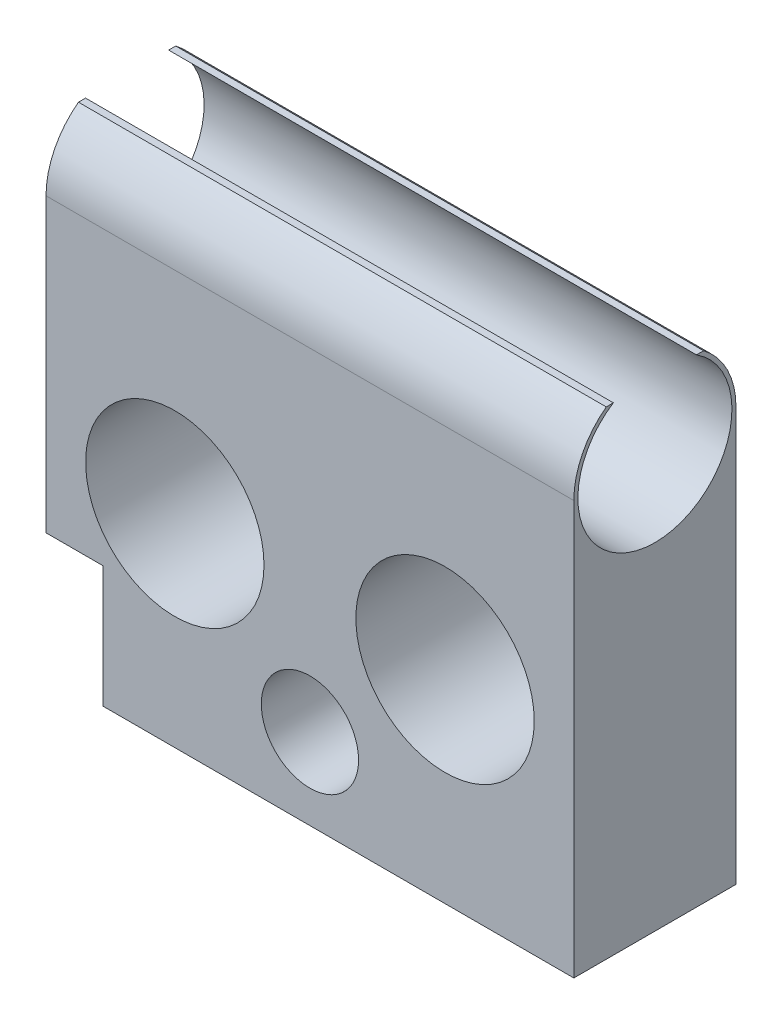
ISO-10303-21;
HEADER;
FILE_DESCRIPTION(('STEP AP214'),'2;1');
FILE_NAME('part.step','',(''),(''),'','','');
FILE_SCHEMA(('AUTOMOTIVE_DESIGN { 1 0 10303 214 1 1 1 1 }'));
ENDSEC;
DATA;
#1=APPLICATION_CONTEXT('core data for automotive mechanical design processes');
#2=APPLICATION_PROTOCOL_DEFINITION('international standard','automotive_design',2000,#1);
#3=PRODUCT_CONTEXT('',#1,'mechanical');
#4=PRODUCT('Part','Part','',(#3));
#5=PRODUCT_RELATED_PRODUCT_CATEGORY('part','',(#4));
#6=PRODUCT_DEFINITION_FORMATION('','',#4);
#7=PRODUCT_DEFINITION_CONTEXT('part definition',#1,'design');
#8=PRODUCT_DEFINITION('design','',#6,#7);
#9=PRODUCT_DEFINITION_SHAPE('','',#8);
#10=(LENGTH_UNIT() NAMED_UNIT(*) SI_UNIT(.MILLI.,.METRE.));
#11=(NAMED_UNIT(*) PLANE_ANGLE_UNIT() SI_UNIT($,.RADIAN.));
#12=(NAMED_UNIT(*) SI_UNIT($,.STERADIAN.) SOLID_ANGLE_UNIT());
#13=UNCERTAINTY_MEASURE_WITH_UNIT(LENGTH_MEASURE(1.E-05),#10,'distance_accuracy_value','');
#14=(GEOMETRIC_REPRESENTATION_CONTEXT(3) GLOBAL_UNCERTAINTY_ASSIGNED_CONTEXT((#13)) GLOBAL_UNIT_ASSIGNED_CONTEXT((#10,
#11,#12)) REPRESENTATION_CONTEXT('',''));
#15=CARTESIAN_POINT('',(0.,0.,0.));
#16=DIRECTION('',(0.,0.,1.));
#17=DIRECTION('',(1.,0.,0.));
#18=AXIS2_PLACEMENT_3D('',#15,#16,#17);
#19=CARTESIAN_POINT('',(32.55,26.,10.));
#20=DIRECTION('',(-1.,0.,0.));
#21=DIRECTION('',(0.,0.,1.));
#22=AXIS2_PLACEMENT_3D('',#19,#20,#21);
#23=CYLINDRICAL_SURFACE('',#22,10.);
#24=CARTESIAN_POINT('',(-32.55,26.,10.));
#25=DIRECTION('',(1.,0.,0.));
#26=DIRECTION('',(0.,0.,1.));
#27=AXIS2_PLACEMENT_3D('',#24,#25,#26);
#28=CIRCLE('',#27,10.);
#29=CARTESIAN_POINT('',(-32.55,26.,0.));
#30=VERTEX_POINT('',#29);
#31=CARTESIAN_POINT('',(-32.55,34.,4.));
#32=VERTEX_POINT('',#31);
#33=EDGE_CURVE('E129',#30,#32,#28,.T.);
#34=ORIENTED_EDGE('',*,*,#33,.T.);
#35=DIRECTION('',(-1.,0.,0.));
#36=VECTOR('',#35,1.);
#37=CARTESIAN_POINT('',(32.55,34.,3.99999999999999));
#38=LINE('',#37,#36);
#39=CARTESIAN_POINT('',(32.55,34.,3.99999999999998));
#40=VERTEX_POINT('',#39);
#41=EDGE_CURVE('E42',#32,#40,#38,.F.);
#42=ORIENTED_EDGE('',*,*,#41,.T.);
#43=CARTESIAN_POINT('',(32.55,26.,10.));
#44=DIRECTION('',(1.,0.,0.));
#45=DIRECTION('',(0.,0.,1.));
#46=AXIS2_PLACEMENT_3D('',#43,#44,#45);
#47=CIRCLE('',#46,10.);
#48=CARTESIAN_POINT('',(32.55,26.,0.));
#49=VERTEX_POINT('',#48);
#50=EDGE_CURVE('E128',#49,#40,#47,.T.);
#51=ORIENTED_EDGE('',*,*,#50,.F.);
#52=DIRECTION('',(-1.,0.,0.));
#53=VECTOR('',#52,1.);
#54=CARTESIAN_POINT('',(32.55,26.,0.));
#55=LINE('',#54,#53);
#56=EDGE_CURVE('E138',#49,#30,#55,.T.);
#57=ORIENTED_EDGE('',*,*,#56,.T.);
#58=EDGE_LOOP('',(#34,#42,#51,#57));
#59=FACE_BOUND('',#58,.T.);
#60=ADVANCED_FACE('F34',(#59),#23,.T.);
#61=CARTESIAN_POINT('',(0.,0.,20.));
#62=DIRECTION('',(0.,0.,-1.));
#63=DIRECTION('',(-1.,0.,0.));
#64=AXIS2_PLACEMENT_3D('',#61,#62,#63);
#65=PLANE('',#64);
#66=CARTESIAN_POINT('',(-16.665,0.,20.));
#67=DIRECTION('',(0.,0.,1.));
#68=DIRECTION('',(1.,0.,0.));
#69=AXIS2_PLACEMENT_3D('',#66,#67,#68);
#70=CIRCLE('',#69,11.);
#71=CARTESIAN_POINT('',(-5.665,0.,20.));
#72=VERTEX_POINT('',#71);
#73=EDGE_CURVE('E155',#72,#72,#70,.T.);
#74=ORIENTED_EDGE('',*,*,#73,.F.);
#75=EDGE_LOOP('',(#74));
#76=FACE_BOUND('',#75,.T.);
#77=CARTESIAN_POINT('',(0.,-15.,20.));
#78=DIRECTION('',(0.,0.,1.));
#79=DIRECTION('',(1.,0.,0.));
#80=AXIS2_PLACEMENT_3D('',#77,#78,#79);
#81=CIRCLE('',#80,6.);
#82=CARTESIAN_POINT('',(6.,-15.,20.));
#83=VERTEX_POINT('',#82);
#84=EDGE_CURVE('E143',#83,#83,#81,.T.);
#85=ORIENTED_EDGE('',*,*,#84,.F.);
#86=EDGE_LOOP('',(#85));
#87=FACE_BOUND('',#86,.T.);
#88=CARTESIAN_POINT('',(16.665,0.,20.));
#89=DIRECTION('',(0.,0.,1.));
#90=DIRECTION('',(1.,0.,0.));
#91=AXIS2_PLACEMENT_3D('',#88,#89,#90);
#92=CIRCLE('',#91,11.);
#93=CARTESIAN_POINT('',(27.665,0.,20.));
#94=VERTEX_POINT('',#93);
#95=EDGE_CURVE('E149',#94,#94,#92,.T.);
#96=ORIENTED_EDGE('',*,*,#95,.F.);
#97=EDGE_LOOP('',(#96));
#98=FACE_BOUND('',#97,.T.);
#99=DIRECTION('',(0.,-1.,0.));
#100=VECTOR('',#99,1.);
#101=CARTESIAN_POINT('',(-32.55,17.,20.));
#102=LINE('',#101,#100);
#103=CARTESIAN_POINT('',(-32.55,26.,20.));
#104=VERTEX_POINT('',#103);
#105=CARTESIAN_POINT('',(-32.55,-10.,20.));
#106=VERTEX_POINT('',#105);
#107=EDGE_CURVE('E169',#104,#106,#102,.T.);
#108=ORIENTED_EDGE('',*,*,#107,.T.);
#109=DIRECTION('',(-1.,0.,0.));
#110=VECTOR('',#109,1.);
#111=CARTESIAN_POINT('',(-32.55,-10.,20.));
#112=LINE('',#111,#110);
#113=CARTESIAN_POINT('',(-25.5,-10.,20.));
#114=VERTEX_POINT('',#113);
#115=EDGE_CURVE('E208',#114,#106,#112,.T.);
#116=ORIENTED_EDGE('',*,*,#115,.F.);
#117=DIRECTION('',(0.,1.,0.));
#118=VECTOR('',#117,1.);
#119=CARTESIAN_POINT('',(-25.5,-25.,20.));
#120=LINE('',#119,#118);
#121=CARTESIAN_POINT('',(-25.5,-25.,20.));
#122=VERTEX_POINT('',#121);
#123=EDGE_CURVE('E204',#122,#114,#120,.T.);
#124=ORIENTED_EDGE('',*,*,#123,.F.);
#125=DIRECTION('',(1.,0.,0.));
#126=VECTOR('',#125,1.);
#127=CARTESIAN_POINT('',(32.55,-25.,20.));
#128=LINE('',#127,#126);
#129=CARTESIAN_POINT('',(32.55,-25.,20.));
#130=VERTEX_POINT('',#129);
#131=EDGE_CURVE('E164',#122,#130,#128,.T.);
#132=ORIENTED_EDGE('',*,*,#131,.T.);
#133=DIRECTION('',(0.,1.,0.));
#134=VECTOR('',#133,1.);
#135=CARTESIAN_POINT('',(32.55,17.,20.));
#136=LINE('',#135,#134);
#137=CARTESIAN_POINT('',(32.55,26.,20.));
#138=VERTEX_POINT('',#137);
#139=EDGE_CURVE('E166',#130,#138,#136,.T.);
#140=ORIENTED_EDGE('',*,*,#139,.T.);
#141=DIRECTION('',(-1.,0.,0.));
#142=VECTOR('',#141,1.);
#143=CARTESIAN_POINT('',(32.55,26.,20.));
#144=LINE('',#143,#142);
#145=EDGE_CURVE('E126',#138,#104,#144,.T.);
#146=ORIENTED_EDGE('',*,*,#145,.T.);
#147=EDGE_LOOP('',(#108,#116,#124,#132,#140,#146));
#148=FACE_BOUND('',#147,.T.);
#149=ADVANCED_FACE('F225',(#76,#87,#98,#148),#65,.F.);
#150=CARTESIAN_POINT('',(0.,0.,0.));
#151=DIRECTION('',(0.,0.,-1.));
#152=DIRECTION('',(-1.,0.,0.));
#153=AXIS2_PLACEMENT_3D('',#150,#151,#152);
#154=PLANE('',#153);
#155=DIRECTION('',(-1.,0.,0.));
#156=VECTOR('',#155,1.);
#157=CARTESIAN_POINT('',(-32.55,-10.,0.));
#158=LINE('',#157,#156);
#159=CARTESIAN_POINT('',(-25.5,-10.,0.));
#160=VERTEX_POINT('',#159);
#161=CARTESIAN_POINT('',(-32.55,-10.,0.));
#162=VERTEX_POINT('',#161);
#163=EDGE_CURVE('E207',#160,#162,#158,.T.);
#164=ORIENTED_EDGE('',*,*,#163,.T.);
#165=DIRECTION('',(0.,-1.,0.));
#166=VECTOR('',#165,1.);
#167=CARTESIAN_POINT('',(-32.55,-25.,0.));
#168=LINE('',#167,#166);
#169=EDGE_CURVE('E175',#30,#162,#168,.T.);
#170=ORIENTED_EDGE('',*,*,#169,.F.);
#171=ORIENTED_EDGE('',*,*,#56,.F.);
#172=DIRECTION('',(0.,1.,0.));
#173=VECTOR('',#172,1.);
#174=CARTESIAN_POINT('',(32.55,17.,0.));
#175=LINE('',#174,#173);
#176=CARTESIAN_POINT('',(32.55,-25.,0.));
#177=VERTEX_POINT('',#176);
#178=EDGE_CURVE('E161',#177,#49,#175,.T.);
#179=ORIENTED_EDGE('',*,*,#178,.F.);
#180=DIRECTION('',(1.,0.,0.));
#181=VECTOR('',#180,1.);
#182=CARTESIAN_POINT('',(-30.55,-25.,0.));
#183=LINE('',#182,#181);
#184=CARTESIAN_POINT('',(-25.5,-25.,0.));
#185=VERTEX_POINT('',#184);
#186=EDGE_CURVE('E167',#185,#177,#183,.T.);
#187=ORIENTED_EDGE('',*,*,#186,.F.);
#188=DIRECTION('',(0.,1.,0.));
#189=VECTOR('',#188,1.);
#190=CARTESIAN_POINT('',(-25.5,-25.,0.));
#191=LINE('',#190,#189);
#192=EDGE_CURVE('E205',#185,#160,#191,.T.);
#193=ORIENTED_EDGE('',*,*,#192,.T.);
#194=EDGE_LOOP('',(#164,#170,#171,#179,#187,#193));
#195=FACE_BOUND('',#194,.T.);
#196=CARTESIAN_POINT('',(16.665,0.,0.));
#197=DIRECTION('',(0.,0.,1.));
#198=DIRECTION('',(1.,0.,0.));
#199=AXIS2_PLACEMENT_3D('',#196,#197,#198);
#200=CIRCLE('',#199,11.);
#201=CARTESIAN_POINT('',(27.665,0.,0.));
#202=VERTEX_POINT('',#201);
#203=EDGE_CURVE('E152',#202,#202,#200,.T.);
#204=ORIENTED_EDGE('',*,*,#203,.T.);
#205=EDGE_LOOP('',(#204));
#206=FACE_BOUND('',#205,.T.);
#207=CARTESIAN_POINT('',(0.,-15.,0.));
#208=DIRECTION('',(0.,0.,1.));
#209=DIRECTION('',(1.,0.,0.));
#210=AXIS2_PLACEMENT_3D('',#207,#208,#209);
#211=CIRCLE('',#210,6.);
#212=CARTESIAN_POINT('',(6.,-15.,0.));
#213=VERTEX_POINT('',#212);
#214=EDGE_CURVE('E146',#213,#213,#211,.T.);
#215=ORIENTED_EDGE('',*,*,#214,.T.);
#216=EDGE_LOOP('',(#215));
#217=FACE_BOUND('',#216,.T.);
#218=CARTESIAN_POINT('',(-16.665,0.,0.));
#219=DIRECTION('',(0.,0.,1.));
#220=DIRECTION('',(1.,0.,0.));
#221=AXIS2_PLACEMENT_3D('',#218,#219,#220);
#222=CIRCLE('',#221,11.);
#223=CARTESIAN_POINT('',(-5.665,0.,0.));
#224=VERTEX_POINT('',#223);
#225=EDGE_CURVE('E158',#224,#224,#222,.T.);
#226=ORIENTED_EDGE('',*,*,#225,.T.);
#227=EDGE_LOOP('',(#226));
#228=FACE_BOUND('',#227,.T.);
#229=ADVANCED_FACE('F189',(#195,#206,#217,#228),#154,.T.);
#230=CARTESIAN_POINT('',(32.55,17.,20.));
#231=DIRECTION('',(-1.,0.,0.));
#232=DIRECTION('',(0.,0.,1.));
#233=AXIS2_PLACEMENT_3D('',#230,#231,#232);
#234=PLANE('',#233);
#235=ORIENTED_EDGE('',*,*,#50,.T.);
#236=DIRECTION('',(0.,0.,-1.));
#237=VECTOR('',#236,1.);
#238=CARTESIAN_POINT('',(32.55,34.,20.));
#239=LINE('',#238,#237);
#240=CARTESIAN_POINT('',(32.55,34.,4.87652461702018));
#241=VERTEX_POINT('',#240);
#242=EDGE_CURVE('E49',#241,#40,#239,.T.);
#243=ORIENTED_EDGE('',*,*,#242,.F.);
#244=CARTESIAN_POINT('',(32.55,26.,10.));
#245=DIRECTION('',(-1.,0.,0.));
#246=DIRECTION('',(0.,0.,1.));
#247=AXIS2_PLACEMENT_3D('',#244,#245,#246);
#248=CIRCLE('',#247,9.5);
#249=CARTESIAN_POINT('',(32.55,34.,15.1234753829798));
#250=VERTEX_POINT('',#249);
#251=EDGE_CURVE('E121',#241,#250,#248,.T.);
#252=ORIENTED_EDGE('',*,*,#251,.T.);
#253=CARTESIAN_POINT('',(32.55,34.,16.));
#254=VERTEX_POINT('',#253);
#255=EDGE_CURVE('E109',#254,#250,#239,.T.);
#256=ORIENTED_EDGE('',*,*,#255,.F.);
#257=EDGE_CURVE('E118',#254,#138,#47,.T.);
#258=ORIENTED_EDGE('',*,*,#257,.T.);
#259=ORIENTED_EDGE('',*,*,#139,.F.);
#260=DIRECTION('',(0.,0.,-1.));
#261=VECTOR('',#260,1.);
#262=CARTESIAN_POINT('',(32.55,-25.,20.));
#263=LINE('',#262,#261);
#264=EDGE_CURVE('E172',#130,#177,#263,.T.);
#265=ORIENTED_EDGE('',*,*,#264,.T.);
#266=ORIENTED_EDGE('',*,*,#178,.T.);
#267=EDGE_LOOP('',(#235,#243,#252,#256,#258,#259,#265,#266));
#268=FACE_BOUND('',#267,.T.);
#269=ADVANCED_FACE('F36',(#268),#234,.F.);
#270=CARTESIAN_POINT('',(-32.55,-25.,20.));
#271=DIRECTION('',(1.,0.,0.));
#272=DIRECTION('',(0.,1.,0.));
#273=AXIS2_PLACEMENT_3D('',#270,#271,#272);
#274=PLANE('',#273);
#275=CARTESIAN_POINT('',(-32.55,34.,16.));
#276=VERTEX_POINT('',#275);
#277=EDGE_CURVE('E132',#276,#104,#28,.T.);
#278=ORIENTED_EDGE('',*,*,#277,.F.);
#279=DIRECTION('',(0.,0.,1.));
#280=VECTOR('',#279,1.);
#281=CARTESIAN_POINT('',(-32.55,34.,20.));
#282=LINE('',#281,#280);
#283=CARTESIAN_POINT('',(-32.55,34.,15.1234753829798));
#284=VERTEX_POINT('',#283);
#285=EDGE_CURVE('E57',#284,#276,#282,.T.);
#286=ORIENTED_EDGE('',*,*,#285,.F.);
#287=CARTESIAN_POINT('',(-32.55,26.,10.));
#288=DIRECTION('',(-1.,0.,0.));
#289=DIRECTION('',(0.,0.,1.));
#290=AXIS2_PLACEMENT_3D('',#287,#288,#289);
#291=CIRCLE('',#290,9.5);
#292=CARTESIAN_POINT('',(-32.55,34.,4.8765246170202));
#293=VERTEX_POINT('',#292);
#294=EDGE_CURVE('E140',#293,#284,#291,.T.);
#295=ORIENTED_EDGE('',*,*,#294,.F.);
#296=EDGE_CURVE('E197',#32,#293,#282,.T.);
#297=ORIENTED_EDGE('',*,*,#296,.F.);
#298=ORIENTED_EDGE('',*,*,#33,.F.);
#299=ORIENTED_EDGE('',*,*,#169,.T.);
#300=DIRECTION('',(0.,0.,1.));
#301=VECTOR('',#300,1.);
#302=CARTESIAN_POINT('',(-32.55,-10.,0.));
#303=LINE('',#302,#301);
#304=EDGE_CURVE('E213',#162,#106,#303,.T.);
#305=ORIENTED_EDGE('',*,*,#304,.T.);
#306=ORIENTED_EDGE('',*,*,#107,.F.);
#307=EDGE_LOOP('',(#278,#286,#295,#297,#298,#299,#305,#306));
#308=FACE_BOUND('',#307,.T.);
#309=ADVANCED_FACE('F194',(#308),#274,.F.);
#310=CARTESIAN_POINT('',(-30.55,-25.,20.));
#311=DIRECTION('',(0.,1.,0.));
#312=DIRECTION('',(-1.,0.,0.));
#313=AXIS2_PLACEMENT_3D('',#310,#311,#312);
#314=PLANE('',#313);
#315=ORIENTED_EDGE('',*,*,#131,.F.);
#316=DIRECTION('',(0.,0.,1.));
#317=VECTOR('',#316,1.);
#318=CARTESIAN_POINT('',(-25.5,-25.,0.));
#319=LINE('',#318,#317);
#320=EDGE_CURVE('E135',#185,#122,#319,.T.);
#321=ORIENTED_EDGE('',*,*,#320,.F.);
#322=ORIENTED_EDGE('',*,*,#186,.T.);
#323=ORIENTED_EDGE('',*,*,#264,.F.);
#324=EDGE_LOOP('',(#315,#321,#322,#323));
#325=FACE_BOUND('',#324,.T.);
#326=ADVANCED_FACE('F226',(#325),#314,.F.);
#327=CARTESIAN_POINT('',(-16.665,0.,0.));
#328=DIRECTION('',(0.,0.,1.));
#329=DIRECTION('',(1.,0.,0.));
#330=AXIS2_PLACEMENT_3D('',#327,#328,#329);
#331=CYLINDRICAL_SURFACE('',#330,11.);
#332=ORIENTED_EDGE('',*,*,#225,.F.);
#333=EDGE_LOOP('',(#332));
#334=FACE_BOUND('',#333,.T.);
#335=ORIENTED_EDGE('',*,*,#73,.T.);
#336=EDGE_LOOP('',(#335));
#337=FACE_BOUND('',#336,.T.);
#338=ADVANCED_FACE('F228',(#334,#337),#331,.F.);
#339=CARTESIAN_POINT('',(0.,-15.,0.));
#340=DIRECTION('',(0.,0.,1.));
#341=DIRECTION('',(1.,0.,0.));
#342=AXIS2_PLACEMENT_3D('',#339,#340,#341);
#343=CYLINDRICAL_SURFACE('',#342,6.);
#344=ORIENTED_EDGE('',*,*,#214,.F.);
#345=EDGE_LOOP('',(#344));
#346=FACE_BOUND('',#345,.T.);
#347=ORIENTED_EDGE('',*,*,#84,.T.);
#348=EDGE_LOOP('',(#347));
#349=FACE_BOUND('',#348,.T.);
#350=ADVANCED_FACE('F234',(#346,#349),#343,.F.);
#351=CARTESIAN_POINT('',(16.665,0.,0.));
#352=DIRECTION('',(0.,0.,1.));
#353=DIRECTION('',(1.,0.,0.));
#354=AXIS2_PLACEMENT_3D('',#351,#352,#353);
#355=CYLINDRICAL_SURFACE('',#354,11.);
#356=ORIENTED_EDGE('',*,*,#203,.F.);
#357=EDGE_LOOP('',(#356));
#358=FACE_BOUND('',#357,.T.);
#359=ORIENTED_EDGE('',*,*,#95,.T.);
#360=EDGE_LOOP('',(#359));
#361=FACE_BOUND('',#360,.T.);
#362=ADVANCED_FACE('F255',(#358,#361),#355,.F.);
#363=CARTESIAN_POINT('',(32.55,26.,10.));
#364=DIRECTION('',(-1.,0.,0.));
#365=DIRECTION('',(0.,0.,1.));
#366=AXIS2_PLACEMENT_3D('',#363,#364,#365);
#367=CYLINDRICAL_SURFACE('',#366,9.5);
#368=ORIENTED_EDGE('',*,*,#294,.T.);
#369=DIRECTION('',(-1.,0.,0.));
#370=VECTOR('',#369,1.);
#371=CARTESIAN_POINT('',(32.55,34.,15.1234753829798));
#372=LINE('',#371,#370);
#373=EDGE_CURVE('E202',#284,#250,#372,.F.);
#374=ORIENTED_EDGE('',*,*,#373,.T.);
#375=ORIENTED_EDGE('',*,*,#251,.F.);
#376=DIRECTION('',(-1.,0.,0.));
#377=VECTOR('',#376,1.);
#378=CARTESIAN_POINT('',(32.55,34.,4.87652461702019));
#379=LINE('',#378,#377);
#380=EDGE_CURVE('E122',#241,#293,#379,.T.);
#381=ORIENTED_EDGE('',*,*,#380,.T.);
#382=EDGE_LOOP('',(#368,#374,#375,#381));
#383=FACE_BOUND('',#382,.T.);
#384=ADVANCED_FACE('F249',(#383),#367,.F.);
#385=ORIENTED_EDGE('',*,*,#257,.F.);
#386=DIRECTION('',(-1.,0.,0.));
#387=VECTOR('',#386,1.);
#388=CARTESIAN_POINT('',(32.55,34.,16.));
#389=LINE('',#388,#387);
#390=EDGE_CURVE('E11',#254,#276,#389,.T.);
#391=ORIENTED_EDGE('',*,*,#390,.T.);
#392=ORIENTED_EDGE('',*,*,#277,.T.);
#393=ORIENTED_EDGE('',*,*,#145,.F.);
#394=EDGE_LOOP('',(#385,#391,#392,#393));
#395=FACE_BOUND('',#394,.T.);
#396=ADVANCED_FACE('F124',(#395),#23,.T.);
#397=CARTESIAN_POINT('',(-32.55,-10.,0.));
#398=DIRECTION('',(0.,1.,0.));
#399=DIRECTION('',(0.,0.,1.));
#400=AXIS2_PLACEMENT_3D('',#397,#398,#399);
#401=PLANE('',#400);
#402=ORIENTED_EDGE('',*,*,#115,.T.);
#403=ORIENTED_EDGE('',*,*,#304,.F.);
#404=ORIENTED_EDGE('',*,*,#163,.F.);
#405=DIRECTION('',(0.,0.,1.));
#406=VECTOR('',#405,1.);
#407=CARTESIAN_POINT('',(-25.5,-10.,0.));
#408=LINE('',#407,#406);
#409=EDGE_CURVE('E214',#160,#114,#408,.T.);
#410=ORIENTED_EDGE('',*,*,#409,.T.);
#411=EDGE_LOOP('',(#402,#403,#404,#410));
#412=FACE_BOUND('',#411,.T.);
#413=ADVANCED_FACE('F248',(#412),#401,.F.);
#414=CARTESIAN_POINT('',(-25.5,-25.,0.));
#415=DIRECTION('',(1.,0.,0.));
#416=DIRECTION('',(0.,0.,-1.));
#417=AXIS2_PLACEMENT_3D('',#414,#415,#416);
#418=PLANE('',#417);
#419=ORIENTED_EDGE('',*,*,#123,.T.);
#420=ORIENTED_EDGE('',*,*,#409,.F.);
#421=ORIENTED_EDGE('',*,*,#192,.F.);
#422=ORIENTED_EDGE('',*,*,#320,.T.);
#423=EDGE_LOOP('',(#419,#420,#421,#422));
#424=FACE_BOUND('',#423,.T.);
#425=ADVANCED_FACE('F220',(#424),#418,.F.);
#426=CARTESIAN_POINT('',(52.6497512422418,34.,20.));
#427=DIRECTION('',(0.,-1.,0.));
#428=DIRECTION('',(1.,0.,0.));
#429=AXIS2_PLACEMENT_3D('',#426,#427,#428);
#430=PLANE('',#429);
#431=ORIENTED_EDGE('',*,*,#242,.T.);
#432=ORIENTED_EDGE('',*,*,#41,.F.);
#433=ORIENTED_EDGE('',*,*,#296,.T.);
#434=ORIENTED_EDGE('',*,*,#380,.F.);
#435=EDGE_LOOP('',(#431,#432,#433,#434));
#436=FACE_BOUND('',#435,.T.);
#437=ADVANCED_FACE('F294',(#436),#430,.F.);
#438=ORIENTED_EDGE('',*,*,#285,.T.);
#439=ORIENTED_EDGE('',*,*,#390,.F.);
#440=ORIENTED_EDGE('',*,*,#255,.T.);
#441=ORIENTED_EDGE('',*,*,#373,.F.);
#442=EDGE_LOOP('',(#438,#439,#440,#441));
#443=FACE_BOUND('',#442,.T.);
#444=ADVANCED_FACE('F108',(#443),#430,.F.);
#445=CLOSED_SHELL('',(#60,#149,#229,#269,#309,#326,#338,#350,#362,#384,#396,#413,#425,#437,#444));
#446=MANIFOLD_SOLID_BREP('B2',#445);
#447=ADVANCED_BREP_SHAPE_REPRESENTATION('',(#18,#446),#14);
#448=SHAPE_DEFINITION_REPRESENTATION(#9,#447);
ENDSEC;
END-ISO-10303-21;
